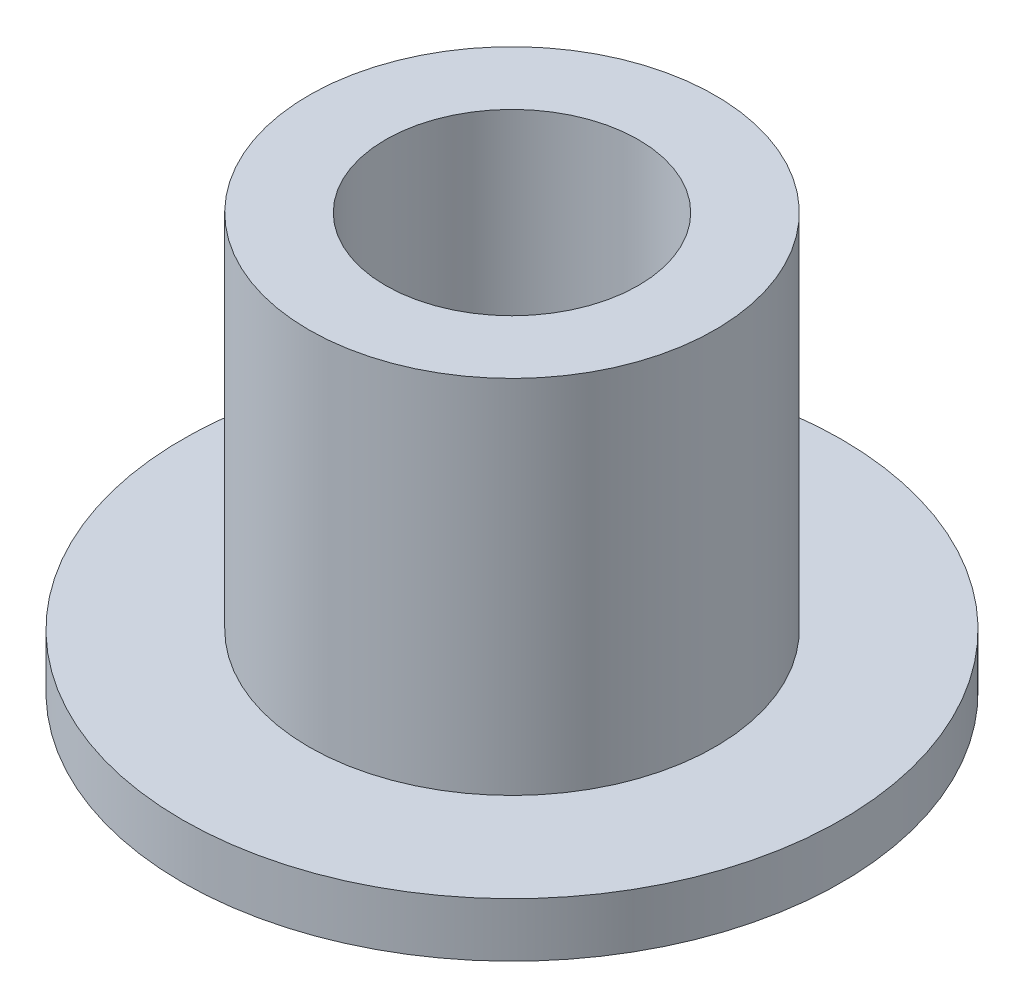
ISO-10303-21;
HEADER;
FILE_DESCRIPTION(('STEP AP214'),'2;1');
FILE_NAME('part.step','',(''),(''),'','','');
FILE_SCHEMA(('AUTOMOTIVE_DESIGN { 1 0 10303 214 1 1 1 1 }'));
ENDSEC;
DATA;
#1=APPLICATION_CONTEXT('core data for automotive mechanical design processes');
#2=APPLICATION_PROTOCOL_DEFINITION('international standard','automotive_design',2000,#1);
#3=PRODUCT_CONTEXT('',#1,'mechanical');
#4=PRODUCT('Part','Part','',(#3));
#5=PRODUCT_RELATED_PRODUCT_CATEGORY('part','',(#4));
#6=PRODUCT_DEFINITION_FORMATION('','',#4);
#7=PRODUCT_DEFINITION_CONTEXT('part definition',#1,'design');
#8=PRODUCT_DEFINITION('design','',#6,#7);
#9=PRODUCT_DEFINITION_SHAPE('','',#8);
#10=(LENGTH_UNIT() NAMED_UNIT(*) SI_UNIT(.MILLI.,.METRE.));
#11=(NAMED_UNIT(*) PLANE_ANGLE_UNIT() SI_UNIT($,.RADIAN.));
#12=(NAMED_UNIT(*) SI_UNIT($,.STERADIAN.) SOLID_ANGLE_UNIT());
#13=UNCERTAINTY_MEASURE_WITH_UNIT(LENGTH_MEASURE(1.E-05),#10,'distance_accuracy_value','');
#14=(GEOMETRIC_REPRESENTATION_CONTEXT(3) GLOBAL_UNCERTAINTY_ASSIGNED_CONTEXT((#13)) GLOBAL_UNIT_ASSIGNED_CONTEXT((#10,
#11,#12)) REPRESENTATION_CONTEXT('',''));
#15=CARTESIAN_POINT('',(0.,0.,0.));
#16=DIRECTION('',(0.,0.,1.));
#17=DIRECTION('',(1.,0.,0.));
#18=AXIS2_PLACEMENT_3D('',#15,#16,#17);
#19=CARTESIAN_POINT('',(0.,-3.81,0.));
#20=DIRECTION('',(0.,1.,0.));
#21=DIRECTION('',(0.,0.,1.));
#22=AXIS2_PLACEMENT_3D('',#19,#20,#21);
#23=CYLINDRICAL_SURFACE('',#22,23.1775);
#24=CARTESIAN_POINT('',(0.,-3.81,0.));
#25=DIRECTION('',(0.,1.,0.));
#26=DIRECTION('',(0.,0.,1.));
#27=AXIS2_PLACEMENT_3D('',#24,#25,#26);
#28=CIRCLE('',#27,23.1775);
#29=CARTESIAN_POINT('',(0.,-3.81,23.1775));
#30=VERTEX_POINT('',#29);
#31=EDGE_CURVE('E10',#30,#30,#28,.T.);
#32=CARTESIAN_POINT('',(0.,0.,0.));
#33=DIRECTION('',(0.,1.,0.));
#34=DIRECTION('',(0.,0.,1.));
#35=AXIS2_PLACEMENT_3D('',#32,#33,#34);
#36=CIRCLE('',#35,23.1775);
#37=CARTESIAN_POINT('',(0.,0.,23.1775));
#38=VERTEX_POINT('',#37);
#39=EDGE_CURVE('E48',#38,#38,#36,.T.);
#40=CARTESIAN_POINT('',(0.,-3.81,23.1775));
#41=CARTESIAN_POINT('',(0.,-3.7703125,23.1775));
#42=CARTESIAN_POINT('',(0.,-3.730625,23.1775));
#43=CARTESIAN_POINT('',(0.,-3.65125,23.1775));
#44=CARTESIAN_POINT('',(0.,-3.6115625,23.1775));
#45=CARTESIAN_POINT('',(0.,-3.5321875,23.1775));
#46=CARTESIAN_POINT('',(0.,-3.4925,23.1775));
#47=CARTESIAN_POINT('',(0.,-3.413125,23.1775));
#48=CARTESIAN_POINT('',(0.,-3.3734375,23.1775));
#49=CARTESIAN_POINT('',(0.,-3.2940625,23.1775));
#50=CARTESIAN_POINT('',(0.,-3.254375,23.1775));
#51=CARTESIAN_POINT('',(0.,-3.175,23.1775));
#52=CARTESIAN_POINT('',(0.,-3.1353125,23.1775));
#53=CARTESIAN_POINT('',(0.,-3.0559375,23.1775));
#54=CARTESIAN_POINT('',(0.,-3.01625,23.1775));
#55=CARTESIAN_POINT('',(0.,-2.936875,23.1775));
#56=CARTESIAN_POINT('',(0.,-2.8971875,23.1775));
#57=CARTESIAN_POINT('',(0.,-2.8178125,23.1775));
#58=CARTESIAN_POINT('',(0.,-2.778125,23.1775));
#59=CARTESIAN_POINT('',(0.,-2.69875,23.1775));
#60=CARTESIAN_POINT('',(0.,-2.6590625,23.1775));
#61=CARTESIAN_POINT('',(0.,-2.5796875,23.1775));
#62=CARTESIAN_POINT('',(0.,-2.54,23.1775));
#63=CARTESIAN_POINT('',(0.,-2.460625,23.1775));
#64=CARTESIAN_POINT('',(0.,-2.4209375,23.1775));
#65=CARTESIAN_POINT('',(0.,-2.3415625,23.1775));
#66=CARTESIAN_POINT('',(0.,-2.301875,23.1775));
#67=CARTESIAN_POINT('',(0.,-2.2225,23.1775));
#68=CARTESIAN_POINT('',(0.,-2.1828125,23.1775));
#69=CARTESIAN_POINT('',(0.,-2.1034375,23.1775));
#70=CARTESIAN_POINT('',(0.,-2.06375,23.1775));
#71=CARTESIAN_POINT('',(0.,-1.984375,23.1775));
#72=CARTESIAN_POINT('',(0.,-1.9446875,23.1775));
#73=CARTESIAN_POINT('',(0.,-1.8653125,23.1775));
#74=CARTESIAN_POINT('',(0.,-1.825625,23.1775));
#75=CARTESIAN_POINT('',(0.,-1.74625,23.1775));
#76=CARTESIAN_POINT('',(0.,-1.7065625,23.1775));
#77=CARTESIAN_POINT('',(0.,-1.6271875,23.1775));
#78=CARTESIAN_POINT('',(0.,-1.5875,23.1775));
#79=CARTESIAN_POINT('',(0.,-1.508125,23.1775));
#80=CARTESIAN_POINT('',(0.,-1.4684375,23.1775));
#81=CARTESIAN_POINT('',(0.,-1.3890625,23.1775));
#82=CARTESIAN_POINT('',(0.,-1.349375,23.1775));
#83=CARTESIAN_POINT('',(0.,-1.27,23.1775));
#84=CARTESIAN_POINT('',(0.,-1.2303125,23.1775));
#85=CARTESIAN_POINT('',(0.,-1.1509375,23.1775));
#86=CARTESIAN_POINT('',(0.,-1.11125,23.1775));
#87=CARTESIAN_POINT('',(0.,-1.031875,23.1775));
#88=CARTESIAN_POINT('',(0.,-0.9921875,23.1775));
#89=CARTESIAN_POINT('',(0.,-0.9128125,23.1775));
#90=CARTESIAN_POINT('',(0.,-0.873125,23.1775));
#91=CARTESIAN_POINT('',(0.,-0.79375,23.1775));
#92=CARTESIAN_POINT('',(0.,-0.7540625,23.1775));
#93=CARTESIAN_POINT('',(0.,-0.6746875,23.1775));
#94=CARTESIAN_POINT('',(0.,-0.635,23.1775));
#95=CARTESIAN_POINT('',(0.,-0.555625,23.1775));
#96=CARTESIAN_POINT('',(0.,-0.5159375,23.1775));
#97=CARTESIAN_POINT('',(0.,-0.4365625,23.1775));
#98=CARTESIAN_POINT('',(0.,-0.396875,23.1775));
#99=CARTESIAN_POINT('',(0.,-0.3175,23.1775));
#100=CARTESIAN_POINT('',(0.,-0.2778125,23.1775));
#101=CARTESIAN_POINT('',(0.,-0.1984375,23.1775));
#102=CARTESIAN_POINT('',(0.,-0.15875,23.1775));
#103=CARTESIAN_POINT('',(0.,-0.0793749999999999,23.1775));
#104=CARTESIAN_POINT('',(0.,-0.0396874999999999,23.1775));
#105=CARTESIAN_POINT('',(0.,0.,23.1775));
#106=B_SPLINE_CURVE_WITH_KNOTS('',3,(#40,#41,#42,#43,#44,#45,#46,#47,#48,#49,#50,#51,#52,#53,
#54,#55,#56,#57,#58,#59,#60,#61,#62,#63,#64,#65,#66,#67,#68,#69,#70,#71,#72,#73,#74,#75,#76,#77,
#78,#79,#80,#81,#82,#83,#84,#85,#86,#87,#88,#89,#90,#91,#92,#93,#94,#95,#96,#97,#98,#99,#100,
#101,#102,#103,#104,#105),.UNSPECIFIED.,.F.,.F.,(4,2,2,2,2,2,2,2,2,2,2,2,2,2,2,2,2,2,2,2,2,2,2,
2,2,2,2,2,2,2,2,2,4),(0.,0.1190625,0.238125,0.3571875,0.47625,0.5953125,0.714375,0.8334375,
0.9525,1.0715625,1.190625,1.3096875,1.42875,1.5478125,1.666875,1.7859375,1.905,2.0240625,
2.143125,2.2621875,2.38125,2.5003125,2.619375,2.7384375,2.8575,2.9765625,3.095625,3.2146875,
3.33375,3.4528125,3.571875,3.6909375,3.81),.UNSPECIFIED.);
#107=EDGE_CURVE('BSEAM45',#30,#38,#106,.T.);
#108=ORIENTED_EDGE('',*,*,#31,.T.);
#109=ORIENTED_EDGE('',*,*,#39,.F.);
#110=ORIENTED_EDGE('',*,*,#107,.T.);
#111=ORIENTED_EDGE('',*,*,#107,.F.);
#112=EDGE_LOOP('',(#108,#110,#109,#111));
#113=FACE_BOUND('',#112,.T.);
#114=ADVANCED_FACE('F45',(#113),#23,.T.);
#115=CARTESIAN_POINT('',(0.,-3.81,0.));
#116=DIRECTION('',(0.,1.,0.));
#117=DIRECTION('',(0.,0.,1.));
#118=AXIS2_PLACEMENT_3D('',#115,#116,#117);
#119=PLANE('',#118);
#120=ORIENTED_EDGE('',*,*,#31,.F.);
#121=EDGE_LOOP('',(#120));
#122=FACE_BOUND('',#121,.T.);
#123=CARTESIAN_POINT('',(0.,-3.81,0.));
#124=DIRECTION('',(0.,1.,0.));
#125=DIRECTION('',(0.,0.,1.));
#126=AXIS2_PLACEMENT_3D('',#123,#124,#125);
#127=CIRCLE('',#126,8.89);
#128=CARTESIAN_POINT('',(0.,-3.81,8.89));
#129=VERTEX_POINT('',#128);
#130=EDGE_CURVE('E60',#129,#129,#127,.F.);
#131=ORIENTED_EDGE('',*,*,#130,.F.);
#132=EDGE_LOOP('',(#131));
#133=FACE_BOUND('',#132,.T.);
#134=ADVANCED_FACE('F93',(#122,#133),#119,.F.);
#135=CARTESIAN_POINT('',(0.,0.,0.));
#136=DIRECTION('',(0.,1.,0.));
#137=DIRECTION('',(0.,0.,1.));
#138=AXIS2_PLACEMENT_3D('',#135,#136,#137);
#139=PLANE('',#138);
#140=CARTESIAN_POINT('',(0.,0.,0.));
#141=DIRECTION('',(0.,1.,0.));
#142=DIRECTION('',(0.,0.,1.));
#143=AXIS2_PLACEMENT_3D('',#140,#141,#142);
#144=CIRCLE('',#143,14.2875);
#145=CARTESIAN_POINT('',(0.,0.,14.2875));
#146=VERTEX_POINT('',#145);
#147=EDGE_CURVE('E58',#146,#146,#144,.T.);
#148=ORIENTED_EDGE('',*,*,#147,.F.);
#149=EDGE_LOOP('',(#148));
#150=FACE_BOUND('',#149,.T.);
#151=ORIENTED_EDGE('',*,*,#39,.T.);
#152=EDGE_LOOP('',(#151));
#153=FACE_BOUND('',#152,.T.);
#154=ADVANCED_FACE('F98',(#150,#153),#139,.T.);
#155=CARTESIAN_POINT('',(0.,-44.2211525448112,0.));
#156=DIRECTION('',(0.,1.,0.));
#157=DIRECTION('',(0.,0.,1.));
#158=AXIS2_PLACEMENT_3D('',#155,#156,#157);
#159=CYLINDRICAL_SURFACE('',#158,8.89);
#160=ORIENTED_EDGE('',*,*,#130,.T.);
#161=EDGE_LOOP('',(#160));
#162=FACE_BOUND('',#161,.T.);
#163=CARTESIAN_POINT('',(0.,25.4,0.));
#164=DIRECTION('',(0.,1.,0.));
#165=DIRECTION('',(0.,0.,1.));
#166=AXIS2_PLACEMENT_3D('',#163,#164,#165);
#167=CIRCLE('',#166,8.89);
#168=CARTESIAN_POINT('',(0.,25.4,8.89));
#169=VERTEX_POINT('',#168);
#170=EDGE_CURVE('E73',#169,#169,#167,.T.);
#171=ORIENTED_EDGE('',*,*,#170,.T.);
#172=EDGE_LOOP('',(#171));
#173=FACE_BOUND('',#172,.T.);
#174=ADVANCED_FACE('F81',(#162,#173),#159,.F.);
#175=CARTESIAN_POINT('',(0.,-44.2211525448112,0.));
#176=DIRECTION('',(0.,1.,0.));
#177=DIRECTION('',(0.,0.,1.));
#178=AXIS2_PLACEMENT_3D('',#175,#176,#177);
#179=CYLINDRICAL_SURFACE('',#178,14.2875);
#180=ORIENTED_EDGE('',*,*,#147,.T.);
#181=EDGE_LOOP('',(#180));
#182=FACE_BOUND('',#181,.T.);
#183=CARTESIAN_POINT('',(0.,25.4,0.));
#184=DIRECTION('',(0.,1.,0.));
#185=DIRECTION('',(0.,0.,1.));
#186=AXIS2_PLACEMENT_3D('',#183,#184,#185);
#187=CIRCLE('',#186,14.2875);
#188=CARTESIAN_POINT('',(0.,25.4,14.2875));
#189=VERTEX_POINT('',#188);
#190=EDGE_CURVE('E68',#189,#189,#187,.T.);
#191=ORIENTED_EDGE('',*,*,#190,.F.);
#192=EDGE_LOOP('',(#191));
#193=FACE_BOUND('',#192,.T.);
#194=ADVANCED_FACE('F85',(#182,#193),#179,.T.);
#195=CARTESIAN_POINT('',(0.,25.4,0.));
#196=DIRECTION('',(0.,1.,0.));
#197=DIRECTION('',(0.,0.,1.));
#198=AXIS2_PLACEMENT_3D('',#195,#196,#197);
#199=PLANE('',#198);
#200=ORIENTED_EDGE('',*,*,#170,.F.);
#201=EDGE_LOOP('',(#200));
#202=FACE_BOUND('',#201,.T.);
#203=ORIENTED_EDGE('',*,*,#190,.T.);
#204=EDGE_LOOP('',(#203));
#205=FACE_BOUND('',#204,.T.);
#206=ADVANCED_FACE('F83',(#202,#205),#199,.T.);
#207=CLOSED_SHELL('',(#114,#134,#154,#174,#194,#206));
#208=MANIFOLD_SOLID_BREP('B2',#207);
#209=ADVANCED_BREP_SHAPE_REPRESENTATION('',(#18,#208),#14);
#210=SHAPE_DEFINITION_REPRESENTATION(#9,#209);
ENDSEC;
END-ISO-10303-21;
